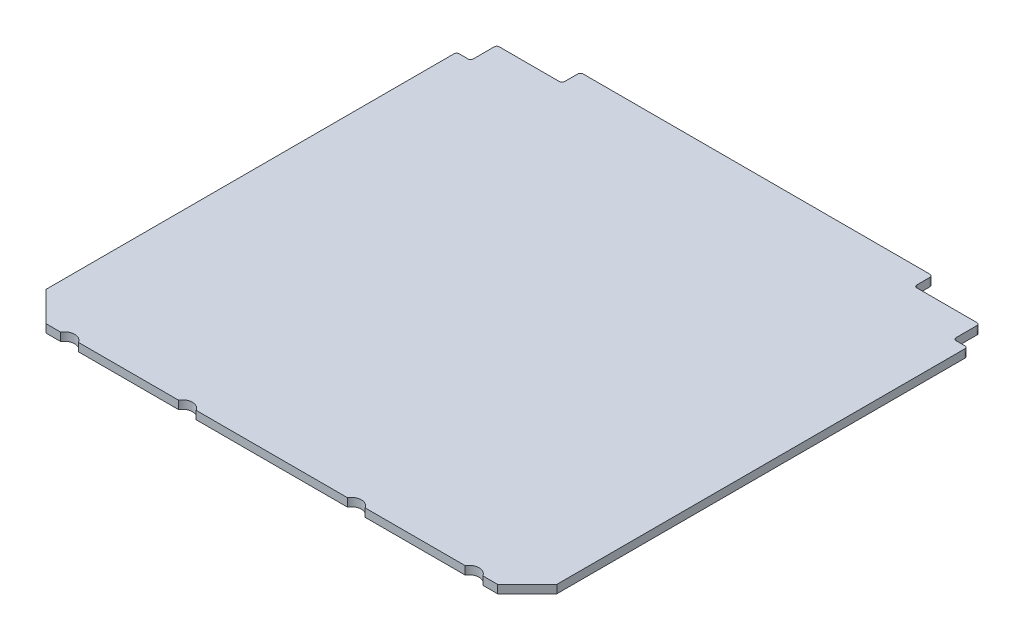
ISO-10303-21;
HEADER;
FILE_DESCRIPTION(('STEP AP214'),'2;1');
FILE_NAME('part.step','',(''),(''),'','','');
FILE_SCHEMA(('AUTOMOTIVE_DESIGN { 1 0 10303 214 1 1 1 1 }'));
ENDSEC;
DATA;
#1=APPLICATION_CONTEXT('core data for automotive mechanical design processes');
#2=APPLICATION_PROTOCOL_DEFINITION('international standard','automotive_design',2000,#1);
#3=PRODUCT_CONTEXT('',#1,'mechanical');
#4=PRODUCT('Part','Part','',(#3));
#5=PRODUCT_RELATED_PRODUCT_CATEGORY('part','',(#4));
#6=PRODUCT_DEFINITION_FORMATION('','',#4);
#7=PRODUCT_DEFINITION_CONTEXT('part definition',#1,'design');
#8=PRODUCT_DEFINITION('design','',#6,#7);
#9=PRODUCT_DEFINITION_SHAPE('','',#8);
#10=(LENGTH_UNIT() NAMED_UNIT(*) SI_UNIT(.MILLI.,.METRE.));
#11=(NAMED_UNIT(*) PLANE_ANGLE_UNIT() SI_UNIT($,.RADIAN.));
#12=(NAMED_UNIT(*) SI_UNIT($,.STERADIAN.) SOLID_ANGLE_UNIT());
#13=UNCERTAINTY_MEASURE_WITH_UNIT(LENGTH_MEASURE(1.E-05),#10,'distance_accuracy_value','');
#14=(GEOMETRIC_REPRESENTATION_CONTEXT(3) GLOBAL_UNCERTAINTY_ASSIGNED_CONTEXT((#13)) GLOBAL_UNIT_ASSIGNED_CONTEXT((#10,
#11,#12)) REPRESENTATION_CONTEXT('',''));
#15=CARTESIAN_POINT('',(0.,0.,0.));
#16=DIRECTION('',(0.,0.,1.));
#17=DIRECTION('',(1.,0.,0.));
#18=AXIS2_PLACEMENT_3D('',#15,#16,#17);
#19=CARTESIAN_POINT('',(-44.4499999999997,0.8,44.4500000000004));
#20=DIRECTION('',(0.707106781186542,0.,-0.707106781186553));
#21=DIRECTION('',(-0.707106781186553,0.,-0.707106781186542));
#22=AXIS2_PLACEMENT_3D('',#19,#20,#21);
#23=PLANE('',#22);
#24=DIRECTION('',(0.,1.,0.));
#25=VECTOR('',#24,1.);
#26=CARTESIAN_POINT('',(-44.1000000000001,-0.8,44.8));
#27=LINE('',#26,#25);
#28=CARTESIAN_POINT('',(-44.1000000000001,-0.8,44.8));
#29=VERTEX_POINT('',#28);
#30=CARTESIAN_POINT('',(-44.1000000000001,0.8,44.8));
#31=VERTEX_POINT('',#30);
#32=EDGE_CURVE('E251',#29,#31,#27,.T.);
#33=ORIENTED_EDGE('',*,*,#32,.T.);
#34=DIRECTION('',(0.707106781186553,0.,0.707106781186542));
#35=VECTOR('',#34,1.);
#36=CARTESIAN_POINT('',(-44.4499999999997,0.8,44.4500000000004));
#37=LINE('',#36,#35);
#38=CARTESIAN_POINT('',(-49.9000000000001,0.8,39.));
#39=VERTEX_POINT('',#38);
#40=EDGE_CURVE('E266',#39,#31,#37,.T.);
#41=ORIENTED_EDGE('',*,*,#40,.F.);
#42=DIRECTION('',(0.,1.,0.));
#43=VECTOR('',#42,1.);
#44=CARTESIAN_POINT('',(-49.9000000000001,-0.8,39.));
#45=LINE('',#44,#43);
#46=CARTESIAN_POINT('',(-49.9000000000001,-0.8,39.));
#47=VERTEX_POINT('',#46);
#48=EDGE_CURVE('E283',#47,#39,#45,.T.);
#49=ORIENTED_EDGE('',*,*,#48,.F.);
#50=DIRECTION('',(0.707106781186553,0.,0.707106781186542));
#51=VECTOR('',#50,1.);
#52=CARTESIAN_POINT('',(-44.4499999999997,-0.8,44.4500000000004));
#53=LINE('',#52,#51);
#54=EDGE_CURVE('E268',#47,#29,#53,.T.);
#55=ORIENTED_EDGE('',*,*,#54,.T.);
#56=EDGE_LOOP('',(#33,#41,#49,#55));
#57=FACE_BOUND('',#56,.T.);
#58=ADVANCED_FACE('F39',(#57),#23,.F.);
#59=CARTESIAN_POINT('',(44.4499999999995,0.8,44.4499999999995));
#60=DIRECTION('',(-0.707106781186548,0.,-0.707106781186548));
#61=DIRECTION('',(-0.707106781186548,0.,0.707106781186548));
#62=AXIS2_PLACEMENT_3D('',#59,#60,#61);
#63=PLANE('',#62);
#64=DIRECTION('',(0.,1.,0.));
#65=VECTOR('',#64,1.);
#66=CARTESIAN_POINT('',(44.0999999999991,-0.8,44.8));
#67=LINE('',#66,#65);
#68=CARTESIAN_POINT('',(44.0999999999991,-0.8,44.8));
#69=VERTEX_POINT('',#68);
#70=CARTESIAN_POINT('',(44.0999999999991,0.8,44.8));
#71=VERTEX_POINT('',#70);
#72=EDGE_CURVE('E269',#69,#71,#67,.T.);
#73=ORIENTED_EDGE('',*,*,#72,.F.);
#74=DIRECTION('',(0.707106781186548,0.,-0.707106781186548));
#75=VECTOR('',#74,1.);
#76=CARTESIAN_POINT('',(44.4499999999995,-0.8,44.4499999999995));
#77=LINE('',#76,#75);
#78=CARTESIAN_POINT('',(49.9000000000001,-0.8,38.999999999999));
#79=VERTEX_POINT('',#78);
#80=EDGE_CURVE('E277',#69,#79,#77,.T.);
#81=ORIENTED_EDGE('',*,*,#80,.T.);
#82=DIRECTION('',(0.,1.,0.));
#83=VECTOR('',#82,1.);
#84=CARTESIAN_POINT('',(49.9000000000001,-0.8,38.999999999999));
#85=LINE('',#84,#83);
#86=CARTESIAN_POINT('',(49.9000000000001,0.8,38.999999999999));
#87=VERTEX_POINT('',#86);
#88=EDGE_CURVE('E286',#79,#87,#85,.T.);
#89=ORIENTED_EDGE('',*,*,#88,.T.);
#90=DIRECTION('',(0.707106781186548,0.,-0.707106781186548));
#91=VECTOR('',#90,1.);
#92=CARTESIAN_POINT('',(44.4499999999995,0.8,44.4499999999995));
#93=LINE('',#92,#91);
#94=EDGE_CURVE('E276',#71,#87,#93,.T.);
#95=ORIENTED_EDGE('',*,*,#94,.F.);
#96=EDGE_LOOP('',(#73,#81,#89,#95));
#97=FACE_BOUND('',#96,.T.);
#98=ADVANCED_FACE('F558',(#97),#63,.F.);
#99=CARTESIAN_POINT('',(0.,0.8,0.));
#100=DIRECTION('',(0.,1.,0.));
#101=DIRECTION('',(0.,0.,1.));
#102=AXIS2_PLACEMENT_3D('',#99,#100,#101);
#103=PLANE('',#102);
#104=DIRECTION('',(0.,0.,-1.));
#105=VECTOR('',#104,1.);
#106=CARTESIAN_POINT('',(34.3999999999997,0.8,0.));
#107=LINE('',#106,#105);
#108=CARTESIAN_POINT('',(34.3999999999997,0.8,-46.8));
#109=VERTEX_POINT('',#108);
#110=CARTESIAN_POINT('',(34.3999999999997,0.8,-49.4));
#111=VERTEX_POINT('',#110);
#112=EDGE_CURVE('E479',#109,#111,#107,.T.);
#113=ORIENTED_EDGE('',*,*,#112,.T.);
#114=CARTESIAN_POINT('',(33.8999999999997,0.8,-49.4));
#115=DIRECTION('',(0.,1.,0.));
#116=DIRECTION('',(0.,0.,1.));
#117=AXIS2_PLACEMENT_3D('',#114,#115,#116);
#118=CIRCLE('',#117,0.5);
#119=CARTESIAN_POINT('',(33.8999999999997,0.8,-49.9));
#120=VERTEX_POINT('',#119);
#121=EDGE_CURVE('E353',#111,#120,#118,.T.);
#122=ORIENTED_EDGE('',*,*,#121,.T.);
#123=DIRECTION('',(-1.,0.,0.));
#124=VECTOR('',#123,1.);
#125=CARTESIAN_POINT('',(0.,0.8,-49.9));
#126=LINE('',#125,#124);
#127=CARTESIAN_POINT('',(-33.9000000000002,0.8,-49.9));
#128=VERTEX_POINT('',#127);
#129=EDGE_CURVE('E476',#120,#128,#126,.T.);
#130=ORIENTED_EDGE('',*,*,#129,.T.);
#131=CARTESIAN_POINT('',(-33.9000000000002,0.8,-49.4));
#132=DIRECTION('',(0.,1.,0.));
#133=DIRECTION('',(0.,0.,1.));
#134=AXIS2_PLACEMENT_3D('',#131,#132,#133);
#135=CIRCLE('',#134,0.5);
#136=CARTESIAN_POINT('',(-34.4000000000002,0.8,-49.4));
#137=VERTEX_POINT('',#136);
#138=EDGE_CURVE('E351',#128,#137,#135,.T.);
#139=ORIENTED_EDGE('',*,*,#138,.T.);
#140=DIRECTION('',(0.,0.,1.));
#141=VECTOR('',#140,1.);
#142=CARTESIAN_POINT('',(-34.4000000000002,0.8,0.));
#143=LINE('',#142,#141);
#144=CARTESIAN_POINT('',(-34.4000000000002,0.8,-46.8));
#145=VERTEX_POINT('',#144);
#146=EDGE_CURVE('E474',#137,#145,#143,.T.);
#147=ORIENTED_EDGE('',*,*,#146,.T.);
#148=CARTESIAN_POINT('',(-34.9000000000002,0.8,-46.8));
#149=DIRECTION('',(0.,1.,0.));
#150=DIRECTION('',(0.,0.,1.));
#151=AXIS2_PLACEMENT_3D('',#148,#149,#150);
#152=CIRCLE('',#151,0.5);
#153=CARTESIAN_POINT('',(-34.9000000000002,0.8,-46.3));
#154=VERTEX_POINT('',#153);
#155=EDGE_CURVE('E325',#145,#154,#152,.F.);
#156=ORIENTED_EDGE('',*,*,#155,.T.);
#157=DIRECTION('',(-1.,0.,0.));
#158=VECTOR('',#157,1.);
#159=CARTESIAN_POINT('',(0.,0.8,-46.3));
#160=LINE('',#159,#158);
#161=CARTESIAN_POINT('',(-46.6500000000002,0.8,-46.3));
#162=VERTEX_POINT('',#161);
#163=EDGE_CURVE('E471',#154,#162,#160,.T.);
#164=ORIENTED_EDGE('',*,*,#163,.T.);
#165=CARTESIAN_POINT('',(-46.6500000000002,0.8,-45.8));
#166=DIRECTION('',(0.,1.,0.));
#167=DIRECTION('',(0.,0.,1.));
#168=AXIS2_PLACEMENT_3D('',#165,#166,#167);
#169=CIRCLE('',#168,0.5);
#170=CARTESIAN_POINT('',(-47.1500000000002,0.8,-45.8));
#171=VERTEX_POINT('',#170);
#172=EDGE_CURVE('E294',#162,#171,#169,.T.);
#173=ORIENTED_EDGE('',*,*,#172,.T.);
#174=DIRECTION('',(0.,0.,1.));
#175=VECTOR('',#174,1.);
#176=CARTESIAN_POINT('',(-47.1500000000002,0.8,0.));
#177=LINE('',#176,#175);
#178=CARTESIAN_POINT('',(-47.1500000000002,0.8,-41.7000000000001));
#179=VERTEX_POINT('',#178);
#180=EDGE_CURVE('E468',#171,#179,#177,.T.);
#181=ORIENTED_EDGE('',*,*,#180,.T.);
#182=CARTESIAN_POINT('',(-47.6500000000002,0.8,-41.7000000000001));
#183=DIRECTION('',(0.,1.,0.));
#184=DIRECTION('',(0.,0.,1.));
#185=AXIS2_PLACEMENT_3D('',#182,#183,#184);
#186=CIRCLE('',#185,0.5);
#187=CARTESIAN_POINT('',(-47.6500000000002,0.8,-41.2000000000001));
#188=VERTEX_POINT('',#187);
#189=EDGE_CURVE('E339',#179,#188,#186,.F.);
#190=ORIENTED_EDGE('',*,*,#189,.T.);
#191=DIRECTION('',(1.,0.,0.));
#192=VECTOR('',#191,1.);
#193=CARTESIAN_POINT('',(-49.9000000000001,0.8,-41.2000000000001));
#194=LINE('',#193,#192);
#195=CARTESIAN_POINT('',(-49.4000000000001,0.8,-41.2000000000001));
#196=VERTEX_POINT('',#195);
#197=EDGE_CURVE('E508',#196,#188,#194,.T.);
#198=ORIENTED_EDGE('',*,*,#197,.F.);
#199=CARTESIAN_POINT('',(-49.4000000000001,0.8,-40.7000000000001));
#200=DIRECTION('',(0.,1.,0.));
#201=DIRECTION('',(0.,0.,1.));
#202=AXIS2_PLACEMENT_3D('',#199,#200,#201);
#203=CIRCLE('',#202,0.5);
#204=CARTESIAN_POINT('',(-49.9000000000001,0.8,-40.7000000000001));
#205=VERTEX_POINT('',#204);
#206=EDGE_CURVE('E349',#196,#205,#203,.T.);
#207=ORIENTED_EDGE('',*,*,#206,.T.);
#208=DIRECTION('',(0.,0.,1.));
#209=VECTOR('',#208,1.);
#210=CARTESIAN_POINT('',(-49.9000000000001,0.8,0.));
#211=LINE('',#210,#209);
#212=EDGE_CURVE('E274',#205,#39,#211,.T.);
#213=ORIENTED_EDGE('',*,*,#212,.T.);
#214=ORIENTED_EDGE('',*,*,#40,.T.);
#215=DIRECTION('',(1.,0.,0.));
#216=VECTOR('',#215,1.);
#217=CARTESIAN_POINT('',(0.,0.8,44.8));
#218=LINE('',#217,#216);
#219=CARTESIAN_POINT('',(-41.2320508075689,0.8,44.8));
#220=VERTEX_POINT('',#219);
#221=EDGE_CURVE('E248',#31,#220,#218,.T.);
#222=ORIENTED_EDGE('',*,*,#221,.T.);
#223=CARTESIAN_POINT('',(-39.5,0.8,45.8));
#224=DIRECTION('',(0.,1.,0.));
#225=DIRECTION('',(0.,0.,1.));
#226=AXIS2_PLACEMENT_3D('',#223,#224,#225);
#227=CIRCLE('',#226,2.);
#228=CARTESIAN_POINT('',(-37.7679491924311,0.8,44.8));
#229=VERTEX_POINT('',#228);
#230=EDGE_CURVE('E428',#229,#220,#227,.T.);
#231=ORIENTED_EDGE('',*,*,#230,.F.);
#232=DIRECTION('',(1.,0.,0.));
#233=VECTOR('',#232,1.);
#234=CARTESIAN_POINT('',(0.,0.8,44.8));
#235=LINE('',#234,#233);
#236=CARTESIAN_POINT('',(-18.2320508075689,0.8,44.8));
#237=VERTEX_POINT('',#236);
#238=EDGE_CURVE('E432',#229,#237,#235,.T.);
#239=ORIENTED_EDGE('',*,*,#238,.T.);
#240=CARTESIAN_POINT('',(-16.5,0.8,45.8));
#241=DIRECTION('',(0.,1.,0.));
#242=DIRECTION('',(0.,0.,1.));
#243=AXIS2_PLACEMENT_3D('',#240,#241,#242);
#244=CIRCLE('',#243,2.);
#245=CARTESIAN_POINT('',(-14.7679491924311,0.8,44.8));
#246=VERTEX_POINT('',#245);
#247=EDGE_CURVE('E526',#246,#237,#244,.T.);
#248=ORIENTED_EDGE('',*,*,#247,.F.);
#249=DIRECTION('',(1.,0.,0.));
#250=VECTOR('',#249,1.);
#251=CARTESIAN_POINT('',(0.,0.8,44.8));
#252=LINE('',#251,#250);
#253=CARTESIAN_POINT('',(14.7679491924311,0.8,44.8));
#254=VERTEX_POINT('',#253);
#255=EDGE_CURVE('E523',#246,#254,#252,.T.);
#256=ORIENTED_EDGE('',*,*,#255,.T.);
#257=CARTESIAN_POINT('',(16.5,0.8,45.8));
#258=DIRECTION('',(0.,1.,0.));
#259=DIRECTION('',(0.,0.,1.));
#260=AXIS2_PLACEMENT_3D('',#257,#258,#259);
#261=CIRCLE('',#260,2.);
#262=CARTESIAN_POINT('',(18.2320508075689,0.8,44.8));
#263=VERTEX_POINT('',#262);
#264=EDGE_CURVE('E520',#263,#254,#261,.T.);
#265=ORIENTED_EDGE('',*,*,#264,.F.);
#266=DIRECTION('',(1.,0.,0.));
#267=VECTOR('',#266,1.);
#268=CARTESIAN_POINT('',(0.,0.8,44.8));
#269=LINE('',#268,#267);
#270=CARTESIAN_POINT('',(37.7679491924311,0.8,44.8));
#271=VERTEX_POINT('',#270);
#272=EDGE_CURVE('E517',#263,#271,#269,.T.);
#273=ORIENTED_EDGE('',*,*,#272,.T.);
#274=CARTESIAN_POINT('',(39.5,0.8,45.8));
#275=DIRECTION('',(0.,1.,0.));
#276=DIRECTION('',(0.,0.,1.));
#277=AXIS2_PLACEMENT_3D('',#274,#275,#276);
#278=CIRCLE('',#277,2.);
#279=CARTESIAN_POINT('',(41.2320508075689,0.8,44.8));
#280=VERTEX_POINT('',#279);
#281=EDGE_CURVE('E514',#280,#271,#278,.T.);
#282=ORIENTED_EDGE('',*,*,#281,.F.);
#283=DIRECTION('',(1.,0.,0.));
#284=VECTOR('',#283,1.);
#285=CARTESIAN_POINT('',(0.,0.8,44.8));
#286=LINE('',#285,#284);
#287=EDGE_CURVE('E259',#280,#71,#286,.T.);
#288=ORIENTED_EDGE('',*,*,#287,.T.);
#289=ORIENTED_EDGE('',*,*,#94,.T.);
#290=DIRECTION('',(0.,0.,-1.));
#291=VECTOR('',#290,1.);
#292=CARTESIAN_POINT('',(49.9000000000001,0.8,0.));
#293=LINE('',#292,#291);
#294=CARTESIAN_POINT('',(49.9000000000001,0.8,-40.7000000000001));
#295=VERTEX_POINT('',#294);
#296=EDGE_CURVE('E380',#87,#295,#293,.T.);
#297=ORIENTED_EDGE('',*,*,#296,.T.);
#298=CARTESIAN_POINT('',(49.4000000000001,0.8,-40.7000000000001));
#299=DIRECTION('',(0.,1.,0.));
#300=DIRECTION('',(0.,0.,1.));
#301=AXIS2_PLACEMENT_3D('',#298,#299,#300);
#302=CIRCLE('',#301,0.5);
#303=CARTESIAN_POINT('',(49.4000000000001,0.8,-41.2000000000001));
#304=VERTEX_POINT('',#303);
#305=EDGE_CURVE('E347',#295,#304,#302,.T.);
#306=ORIENTED_EDGE('',*,*,#305,.T.);
#307=DIRECTION('',(1.,0.,0.));
#308=VECTOR('',#307,1.);
#309=CARTESIAN_POINT('',(49.9000000000001,0.8,-41.2000000000001));
#310=LINE('',#309,#308);
#311=CARTESIAN_POINT('',(47.6499999999999,0.8,-41.2000000000001));
#312=VERTEX_POINT('',#311);
#313=EDGE_CURVE('E504',#312,#304,#310,.T.);
#314=ORIENTED_EDGE('',*,*,#313,.F.);
#315=CARTESIAN_POINT('',(47.6499999999999,0.8,-41.7000000000001));
#316=DIRECTION('',(0.,1.,0.));
#317=DIRECTION('',(0.,0.,1.));
#318=AXIS2_PLACEMENT_3D('',#315,#316,#317);
#319=CIRCLE('',#318,0.5);
#320=CARTESIAN_POINT('',(47.1499999999999,0.8,-41.7000000000001));
#321=VERTEX_POINT('',#320);
#322=EDGE_CURVE('E334',#312,#321,#319,.F.);
#323=ORIENTED_EDGE('',*,*,#322,.T.);
#324=DIRECTION('',(0.,0.,-1.));
#325=VECTOR('',#324,1.);
#326=CARTESIAN_POINT('',(47.1499999999999,0.8,0.));
#327=LINE('',#326,#325);
#328=CARTESIAN_POINT('',(47.1499999999999,0.8,-45.8));
#329=VERTEX_POINT('',#328);
#330=EDGE_CURVE('E391',#321,#329,#327,.T.);
#331=ORIENTED_EDGE('',*,*,#330,.T.);
#332=CARTESIAN_POINT('',(46.6499999999999,0.8,-45.8));
#333=DIRECTION('',(0.,1.,0.));
#334=DIRECTION('',(0.,0.,1.));
#335=AXIS2_PLACEMENT_3D('',#332,#333,#334);
#336=CIRCLE('',#335,0.5);
#337=CARTESIAN_POINT('',(46.6499999999999,0.8,-46.3));
#338=VERTEX_POINT('',#337);
#339=EDGE_CURVE('E292',#329,#338,#336,.T.);
#340=ORIENTED_EDGE('',*,*,#339,.T.);
#341=DIRECTION('',(-1.,0.,0.));
#342=VECTOR('',#341,1.);
#343=CARTESIAN_POINT('',(0.,0.8,-46.3));
#344=LINE('',#343,#342);
#345=CARTESIAN_POINT('',(34.8999999999997,0.8,-46.3));
#346=VERTEX_POINT('',#345);
#347=EDGE_CURVE('E396',#338,#346,#344,.T.);
#348=ORIENTED_EDGE('',*,*,#347,.T.);
#349=CARTESIAN_POINT('',(34.8999999999997,0.8,-46.8));
#350=DIRECTION('',(0.,1.,0.));
#351=DIRECTION('',(0.,0.,1.));
#352=AXIS2_PLACEMENT_3D('',#349,#350,#351);
#353=CIRCLE('',#352,0.5);
#354=EDGE_CURVE('E330',#346,#109,#353,.F.);
#355=ORIENTED_EDGE('',*,*,#354,.T.);
#356=EDGE_LOOP('',(#113,#122,#130,#139,#147,#156,#164,#173,#181,#190,#198,#207,#213,#214,#222,
#231,#239,#248,#256,#265,#273,#282,#288,#289,#297,#306,#314,#323,#331,#340,#348,#355));
#357=FACE_BOUND('',#356,.T.);
#358=ADVANCED_FACE('F273',(#357),#103,.T.);
#359=CARTESIAN_POINT('',(0.,-0.8,0.));
#360=DIRECTION('',(0.,1.,0.));
#361=DIRECTION('',(0.,0.,1.));
#362=AXIS2_PLACEMENT_3D('',#359,#360,#361);
#363=PLANE('',#362);
#364=DIRECTION('',(-1.,0.,0.));
#365=VECTOR('',#364,1.);
#366=CARTESIAN_POINT('',(0.,-0.8,-49.9));
#367=LINE('',#366,#365);
#368=CARTESIAN_POINT('',(33.8999999999997,-0.8,-49.9));
#369=VERTEX_POINT('',#368);
#370=CARTESIAN_POINT('',(-33.9000000000002,-0.8,-49.9));
#371=VERTEX_POINT('',#370);
#372=EDGE_CURVE('E407',#369,#371,#367,.T.);
#373=ORIENTED_EDGE('',*,*,#372,.F.);
#374=CARTESIAN_POINT('',(33.8999999999997,-0.8,-49.4));
#375=DIRECTION('',(0.,1.,0.));
#376=DIRECTION('',(0.,0.,1.));
#377=AXIS2_PLACEMENT_3D('',#374,#375,#376);
#378=CIRCLE('',#377,0.5);
#379=CARTESIAN_POINT('',(34.3999999999997,-0.8,-49.4));
#380=VERTEX_POINT('',#379);
#381=EDGE_CURVE('E365',#369,#380,#378,.F.);
#382=ORIENTED_EDGE('',*,*,#381,.T.);
#383=DIRECTION('',(0.,0.,-1.));
#384=VECTOR('',#383,1.);
#385=CARTESIAN_POINT('',(34.3999999999997,-0.8,0.));
#386=LINE('',#385,#384);
#387=CARTESIAN_POINT('',(34.3999999999997,-0.8,-46.8));
#388=VERTEX_POINT('',#387);
#389=EDGE_CURVE('E410',#388,#380,#386,.T.);
#390=ORIENTED_EDGE('',*,*,#389,.F.);
#391=CARTESIAN_POINT('',(34.8999999999997,-0.8,-46.8));
#392=DIRECTION('',(0.,1.,0.));
#393=DIRECTION('',(0.,0.,1.));
#394=AXIS2_PLACEMENT_3D('',#391,#392,#393);
#395=CIRCLE('',#394,0.5);
#396=CARTESIAN_POINT('',(34.8999999999997,-0.8,-46.3));
#397=VERTEX_POINT('',#396);
#398=EDGE_CURVE('E332',#388,#397,#395,.T.);
#399=ORIENTED_EDGE('',*,*,#398,.T.);
#400=DIRECTION('',(-1.,0.,0.));
#401=VECTOR('',#400,1.);
#402=CARTESIAN_POINT('',(0.,-0.8,-46.3));
#403=LINE('',#402,#401);
#404=CARTESIAN_POINT('',(46.6499999999999,-0.8,-46.3));
#405=VERTEX_POINT('',#404);
#406=EDGE_CURVE('E413',#405,#397,#403,.T.);
#407=ORIENTED_EDGE('',*,*,#406,.F.);
#408=CARTESIAN_POINT('',(46.6499999999999,-0.8,-45.8));
#409=DIRECTION('',(0.,1.,0.));
#410=DIRECTION('',(0.,0.,1.));
#411=AXIS2_PLACEMENT_3D('',#408,#409,#410);
#412=CIRCLE('',#411,0.5);
#413=CARTESIAN_POINT('',(47.1499999999999,-0.8,-45.8));
#414=VERTEX_POINT('',#413);
#415=EDGE_CURVE('E301',#405,#414,#412,.F.);
#416=ORIENTED_EDGE('',*,*,#415,.T.);
#417=DIRECTION('',(0.,0.,-1.));
#418=VECTOR('',#417,1.);
#419=CARTESIAN_POINT('',(47.1499999999999,-0.8,0.));
#420=LINE('',#419,#418);
#421=CARTESIAN_POINT('',(47.1499999999999,-0.8,-41.7000000000001));
#422=VERTEX_POINT('',#421);
#423=EDGE_CURVE('E416',#422,#414,#420,.T.);
#424=ORIENTED_EDGE('',*,*,#423,.F.);
#425=CARTESIAN_POINT('',(47.6499999999999,-0.8,-41.7000000000001));
#426=DIRECTION('',(0.,1.,0.));
#427=DIRECTION('',(0.,0.,1.));
#428=AXIS2_PLACEMENT_3D('',#425,#426,#427);
#429=CIRCLE('',#428,0.5);
#430=CARTESIAN_POINT('',(47.6499999999999,-0.8,-41.2000000000001));
#431=VERTEX_POINT('',#430);
#432=EDGE_CURVE('E336',#422,#431,#429,.T.);
#433=ORIENTED_EDGE('',*,*,#432,.T.);
#434=DIRECTION('',(-1.,0.,0.));
#435=VECTOR('',#434,1.);
#436=CARTESIAN_POINT('',(49.9000000000001,-0.8,-41.2000000000001));
#437=LINE('',#436,#435);
#438=CARTESIAN_POINT('',(49.4000000000001,-0.8,-41.2000000000001));
#439=VERTEX_POINT('',#438);
#440=EDGE_CURVE('E502',#439,#431,#437,.T.);
#441=ORIENTED_EDGE('',*,*,#440,.F.);
#442=CARTESIAN_POINT('',(49.4000000000001,-0.8,-40.7000000000001));
#443=DIRECTION('',(0.,1.,0.));
#444=DIRECTION('',(0.,0.,1.));
#445=AXIS2_PLACEMENT_3D('',#442,#443,#444);
#446=CIRCLE('',#445,0.5);
#447=CARTESIAN_POINT('',(49.9000000000001,-0.8,-40.7000000000001));
#448=VERTEX_POINT('',#447);
#449=EDGE_CURVE('E360',#439,#448,#446,.F.);
#450=ORIENTED_EDGE('',*,*,#449,.T.);
#451=DIRECTION('',(0.,0.,-1.));
#452=VECTOR('',#451,1.);
#453=CARTESIAN_POINT('',(49.9000000000001,-0.8,0.));
#454=LINE('',#453,#452);
#455=EDGE_CURVE('E383',#79,#448,#454,.T.);
#456=ORIENTED_EDGE('',*,*,#455,.F.);
#457=ORIENTED_EDGE('',*,*,#80,.F.);
#458=DIRECTION('',(1.,0.,0.));
#459=VECTOR('',#458,1.);
#460=CARTESIAN_POINT('',(0.,-0.8,44.8));
#461=LINE('',#460,#459);
#462=CARTESIAN_POINT('',(41.2320508075689,-0.8,44.8));
#463=VERTEX_POINT('',#462);
#464=EDGE_CURVE('E427',#463,#69,#461,.T.);
#465=ORIENTED_EDGE('',*,*,#464,.F.);
#466=CARTESIAN_POINT('',(39.5,-0.8,45.8));
#467=DIRECTION('',(0.,1.,0.));
#468=DIRECTION('',(0.,0.,1.));
#469=AXIS2_PLACEMENT_3D('',#466,#467,#468);
#470=CIRCLE('',#469,2.);
#471=CARTESIAN_POINT('',(37.7679491924311,-0.8,44.8));
#472=VERTEX_POINT('',#471);
#473=EDGE_CURVE('E430',#463,#472,#470,.T.);
#474=ORIENTED_EDGE('',*,*,#473,.T.);
#475=DIRECTION('',(1.,0.,0.));
#476=VECTOR('',#475,1.);
#477=CARTESIAN_POINT('',(0.,-0.8,44.8));
#478=LINE('',#477,#476);
#479=CARTESIAN_POINT('',(18.2320508075689,-0.8,44.8));
#480=VERTEX_POINT('',#479);
#481=EDGE_CURVE('E438',#480,#472,#478,.T.);
#482=ORIENTED_EDGE('',*,*,#481,.F.);
#483=CARTESIAN_POINT('',(16.5,-0.8,45.8));
#484=DIRECTION('',(0.,1.,0.));
#485=DIRECTION('',(0.,0.,1.));
#486=AXIS2_PLACEMENT_3D('',#483,#484,#485);
#487=CIRCLE('',#486,2.);
#488=CARTESIAN_POINT('',(14.7679491924311,-0.8,44.8));
#489=VERTEX_POINT('',#488);
#490=EDGE_CURVE('E440',#480,#489,#487,.T.);
#491=ORIENTED_EDGE('',*,*,#490,.T.);
#492=DIRECTION('',(1.,0.,0.));
#493=VECTOR('',#492,1.);
#494=CARTESIAN_POINT('',(0.,-0.8,44.8));
#495=LINE('',#494,#493);
#496=CARTESIAN_POINT('',(-14.7679491924311,-0.8,44.8));
#497=VERTEX_POINT('',#496);
#498=EDGE_CURVE('E443',#497,#489,#495,.T.);
#499=ORIENTED_EDGE('',*,*,#498,.F.);
#500=CARTESIAN_POINT('',(-16.5,-0.8,45.8));
#501=DIRECTION('',(0.,1.,0.));
#502=DIRECTION('',(0.,0.,1.));
#503=AXIS2_PLACEMENT_3D('',#500,#501,#502);
#504=CIRCLE('',#503,2.);
#505=CARTESIAN_POINT('',(-18.2320508075689,-0.8,44.8));
#506=VERTEX_POINT('',#505);
#507=EDGE_CURVE('E445',#497,#506,#504,.T.);
#508=ORIENTED_EDGE('',*,*,#507,.T.);
#509=DIRECTION('',(1.,0.,0.));
#510=VECTOR('',#509,1.);
#511=CARTESIAN_POINT('',(0.,-0.8,44.8));
#512=LINE('',#511,#510);
#513=CARTESIAN_POINT('',(-37.7679491924311,-0.8,44.8));
#514=VERTEX_POINT('',#513);
#515=EDGE_CURVE('E448',#514,#506,#512,.T.);
#516=ORIENTED_EDGE('',*,*,#515,.F.);
#517=CARTESIAN_POINT('',(-39.5,-0.8,45.8));
#518=DIRECTION('',(0.,1.,0.));
#519=DIRECTION('',(0.,0.,1.));
#520=AXIS2_PLACEMENT_3D('',#517,#518,#519);
#521=CIRCLE('',#520,2.);
#522=CARTESIAN_POINT('',(-41.2320508075689,-0.8,44.8));
#523=VERTEX_POINT('',#522);
#524=EDGE_CURVE('E270',#514,#523,#521,.T.);
#525=ORIENTED_EDGE('',*,*,#524,.T.);
#526=DIRECTION('',(1.,0.,0.));
#527=VECTOR('',#526,1.);
#528=CARTESIAN_POINT('',(0.,-0.8,44.8));
#529=LINE('',#528,#527);
#530=EDGE_CURVE('E424',#29,#523,#529,.T.);
#531=ORIENTED_EDGE('',*,*,#530,.F.);
#532=ORIENTED_EDGE('',*,*,#54,.F.);
#533=DIRECTION('',(0.,0.,1.));
#534=VECTOR('',#533,1.);
#535=CARTESIAN_POINT('',(-49.9000000000001,-0.8,0.));
#536=LINE('',#535,#534);
#537=CARTESIAN_POINT('',(-49.9000000000001,-0.8,-40.7000000000001));
#538=VERTEX_POINT('',#537);
#539=EDGE_CURVE('E390',#538,#47,#536,.T.);
#540=ORIENTED_EDGE('',*,*,#539,.F.);
#541=CARTESIAN_POINT('',(-49.4000000000001,-0.8,-40.7000000000001));
#542=DIRECTION('',(0.,1.,0.));
#543=DIRECTION('',(0.,0.,1.));
#544=AXIS2_PLACEMENT_3D('',#541,#542,#543);
#545=CIRCLE('',#544,0.5);
#546=CARTESIAN_POINT('',(-49.4000000000001,-0.8,-41.2000000000001));
#547=VERTEX_POINT('',#546);
#548=EDGE_CURVE('E54',#538,#547,#545,.F.);
#549=ORIENTED_EDGE('',*,*,#548,.T.);
#550=DIRECTION('',(-1.,0.,0.));
#551=VECTOR('',#550,1.);
#552=CARTESIAN_POINT('',(-49.9000000000001,-0.8,-41.2000000000001));
#553=LINE('',#552,#551);
#554=CARTESIAN_POINT('',(-47.6500000000002,-0.8,-41.2000000000001));
#555=VERTEX_POINT('',#554);
#556=EDGE_CURVE('E260',#555,#547,#553,.T.);
#557=ORIENTED_EDGE('',*,*,#556,.F.);
#558=CARTESIAN_POINT('',(-47.6500000000002,-0.8,-41.7000000000001));
#559=DIRECTION('',(0.,1.,0.));
#560=DIRECTION('',(0.,0.,1.));
#561=AXIS2_PLACEMENT_3D('',#558,#559,#560);
#562=CIRCLE('',#561,0.5);
#563=CARTESIAN_POINT('',(-47.1500000000002,-0.8,-41.7000000000001));
#564=VERTEX_POINT('',#563);
#565=EDGE_CURVE('E342',#555,#564,#562,.T.);
#566=ORIENTED_EDGE('',*,*,#565,.T.);
#567=DIRECTION('',(0.,0.,1.));
#568=VECTOR('',#567,1.);
#569=CARTESIAN_POINT('',(-47.1500000000002,-0.8,0.));
#570=LINE('',#569,#568);
#571=CARTESIAN_POINT('',(-47.1500000000002,-0.8,-45.8));
#572=VERTEX_POINT('',#571);
#573=EDGE_CURVE('E393',#572,#564,#570,.T.);
#574=ORIENTED_EDGE('',*,*,#573,.F.);
#575=CARTESIAN_POINT('',(-46.6500000000002,-0.8,-45.8));
#576=DIRECTION('',(0.,1.,0.));
#577=DIRECTION('',(0.,0.,1.));
#578=AXIS2_PLACEMENT_3D('',#575,#576,#577);
#579=CIRCLE('',#578,0.5);
#580=CARTESIAN_POINT('',(-46.6500000000002,-0.8,-46.3));
#581=VERTEX_POINT('',#580);
#582=EDGE_CURVE('E303',#572,#581,#579,.F.);
#583=ORIENTED_EDGE('',*,*,#582,.T.);
#584=DIRECTION('',(-1.,0.,0.));
#585=VECTOR('',#584,1.);
#586=CARTESIAN_POINT('',(0.,-0.8,-46.3));
#587=LINE('',#586,#585);
#588=CARTESIAN_POINT('',(-34.9000000000002,-0.8,-46.3));
#589=VERTEX_POINT('',#588);
#590=EDGE_CURVE('E402',#589,#581,#587,.T.);
#591=ORIENTED_EDGE('',*,*,#590,.F.);
#592=CARTESIAN_POINT('',(-34.9000000000002,-0.8,-46.8));
#593=DIRECTION('',(0.,1.,0.));
#594=DIRECTION('',(0.,0.,1.));
#595=AXIS2_PLACEMENT_3D('',#592,#593,#594);
#596=CIRCLE('',#595,0.5);
#597=CARTESIAN_POINT('',(-34.4000000000002,-0.8,-46.8));
#598=VERTEX_POINT('',#597);
#599=EDGE_CURVE('E327',#589,#598,#596,.T.);
#600=ORIENTED_EDGE('',*,*,#599,.T.);
#601=DIRECTION('',(0.,0.,1.));
#602=VECTOR('',#601,1.);
#603=CARTESIAN_POINT('',(-34.4000000000002,-0.8,0.));
#604=LINE('',#603,#602);
#605=CARTESIAN_POINT('',(-34.4000000000002,-0.8,-49.4));
#606=VERTEX_POINT('',#605);
#607=EDGE_CURVE('E405',#606,#598,#604,.T.);
#608=ORIENTED_EDGE('',*,*,#607,.F.);
#609=CARTESIAN_POINT('',(-33.9000000000002,-0.8,-49.4));
#610=DIRECTION('',(0.,1.,0.));
#611=DIRECTION('',(0.,0.,1.));
#612=AXIS2_PLACEMENT_3D('',#609,#610,#611);
#613=CIRCLE('',#612,0.5);
#614=EDGE_CURVE('E363',#606,#371,#613,.F.);
#615=ORIENTED_EDGE('',*,*,#614,.T.);
#616=EDGE_LOOP('',(#373,#382,#390,#399,#407,#416,#424,#433,#441,#450,#456,#457,#465,#474,#482,
#491,#499,#508,#516,#525,#531,#532,#540,#549,#557,#566,#574,#583,#591,#600,#608,#615));
#617=FACE_BOUND('',#616,.T.);
#618=ADVANCED_FACE('F422',(#617),#363,.F.);
#619=CARTESIAN_POINT('',(49.9000000000001,-0.8,0.));
#620=DIRECTION('',(1.,0.,0.));
#621=DIRECTION('',(0.,0.,-1.));
#622=AXIS2_PLACEMENT_3D('',#619,#620,#621);
#623=PLANE('',#622);
#624=ORIENTED_EDGE('',*,*,#455,.T.);
#625=DIRECTION('',(0.,1.,0.));
#626=VECTOR('',#625,1.);
#627=CARTESIAN_POINT('',(49.9000000000001,0.8,-40.7000000000001));
#628=LINE('',#627,#626);
#629=EDGE_CURVE('E47',#448,#295,#628,.T.);
#630=ORIENTED_EDGE('',*,*,#629,.T.);
#631=ORIENTED_EDGE('',*,*,#296,.F.);
#632=ORIENTED_EDGE('',*,*,#88,.F.);
#633=EDGE_LOOP('',(#624,#630,#631,#632));
#634=FACE_BOUND('',#633,.T.);
#635=ADVANCED_FACE('F378',(#634),#623,.T.);
#636=CARTESIAN_POINT('',(47.1499999999999,-0.8,0.));
#637=DIRECTION('',(1.,0.,0.));
#638=DIRECTION('',(0.,0.,-1.));
#639=AXIS2_PLACEMENT_3D('',#636,#637,#638);
#640=PLANE('',#639);
#641=ORIENTED_EDGE('',*,*,#423,.T.);
#642=DIRECTION('',(0.,1.,0.));
#643=VECTOR('',#642,1.);
#644=CARTESIAN_POINT('',(47.1499999999999,-0.8,-45.8));
#645=LINE('',#644,#643);
#646=EDGE_CURVE('E307',#414,#329,#645,.T.);
#647=ORIENTED_EDGE('',*,*,#646,.T.);
#648=ORIENTED_EDGE('',*,*,#330,.F.);
#649=DIRECTION('',(0.,1.,0.));
#650=VECTOR('',#649,1.);
#651=CARTESIAN_POINT('',(47.1499999999999,-0.8,-41.7000000000001));
#652=LINE('',#651,#650);
#653=EDGE_CURVE('E305',#321,#422,#652,.F.);
#654=ORIENTED_EDGE('',*,*,#653,.T.);
#655=EDGE_LOOP('',(#641,#647,#648,#654));
#656=FACE_BOUND('',#655,.T.);
#657=ADVANCED_FACE('F495',(#656),#640,.T.);
#658=CARTESIAN_POINT('',(0.,-0.8,-46.3));
#659=DIRECTION('',(0.,0.,-1.));
#660=DIRECTION('',(-1.,0.,0.));
#661=AXIS2_PLACEMENT_3D('',#658,#659,#660);
#662=PLANE('',#661);
#663=ORIENTED_EDGE('',*,*,#347,.F.);
#664=DIRECTION('',(0.,1.,0.));
#665=VECTOR('',#664,1.);
#666=CARTESIAN_POINT('',(46.6499999999999,-0.8,-46.3));
#667=LINE('',#666,#665);
#668=EDGE_CURVE('E313',#338,#405,#667,.F.);
#669=ORIENTED_EDGE('',*,*,#668,.T.);
#670=ORIENTED_EDGE('',*,*,#406,.T.);
#671=DIRECTION('',(0.,1.,0.));
#672=VECTOR('',#671,1.);
#673=CARTESIAN_POINT('',(34.8999999999997,0.8,-46.3));
#674=LINE('',#673,#672);
#675=EDGE_CURVE('E310',#397,#346,#674,.T.);
#676=ORIENTED_EDGE('',*,*,#675,.T.);
#677=EDGE_LOOP('',(#663,#669,#670,#676));
#678=FACE_BOUND('',#677,.T.);
#679=ADVANCED_FACE('F485',(#678),#662,.T.);
#680=CARTESIAN_POINT('',(34.3999999999997,-0.8,0.));
#681=DIRECTION('',(1.,0.,0.));
#682=DIRECTION('',(0.,0.,-1.));
#683=AXIS2_PLACEMENT_3D('',#680,#681,#682);
#684=PLANE('',#683);
#685=ORIENTED_EDGE('',*,*,#389,.T.);
#686=DIRECTION('',(0.,1.,0.));
#687=VECTOR('',#686,1.);
#688=CARTESIAN_POINT('',(34.3999999999997,-0.8,-49.4));
#689=LINE('',#688,#687);
#690=EDGE_CURVE('E344',#380,#111,#689,.T.);
#691=ORIENTED_EDGE('',*,*,#690,.T.);
#692=ORIENTED_EDGE('',*,*,#112,.F.);
#693=DIRECTION('',(0.,1.,0.));
#694=VECTOR('',#693,1.);
#695=CARTESIAN_POINT('',(34.3999999999997,-0.8,-46.8));
#696=LINE('',#695,#694);
#697=EDGE_CURVE('E318',#109,#388,#696,.F.);
#698=ORIENTED_EDGE('',*,*,#697,.T.);
#699=EDGE_LOOP('',(#685,#691,#692,#698));
#700=FACE_BOUND('',#699,.T.);
#701=ADVANCED_FACE('F647',(#700),#684,.T.);
#702=CARTESIAN_POINT('',(0.,-0.8,-49.9));
#703=DIRECTION('',(0.,0.,-1.));
#704=DIRECTION('',(-1.,0.,0.));
#705=AXIS2_PLACEMENT_3D('',#702,#703,#704);
#706=PLANE('',#705);
#707=ORIENTED_EDGE('',*,*,#129,.F.);
#708=DIRECTION('',(0.,1.,0.));
#709=VECTOR('',#708,1.);
#710=CARTESIAN_POINT('',(33.8999999999997,-0.8,-49.9));
#711=LINE('',#710,#709);
#712=EDGE_CURVE('E358',#120,#369,#711,.F.);
#713=ORIENTED_EDGE('',*,*,#712,.T.);
#714=ORIENTED_EDGE('',*,*,#372,.T.);
#715=DIRECTION('',(0.,1.,0.));
#716=VECTOR('',#715,1.);
#717=CARTESIAN_POINT('',(-33.9000000000002,-0.8,-49.9));
#718=LINE('',#717,#716);
#719=EDGE_CURVE('E355',#371,#128,#718,.T.);
#720=ORIENTED_EDGE('',*,*,#719,.T.);
#721=EDGE_LOOP('',(#707,#713,#714,#720));
#722=FACE_BOUND('',#721,.T.);
#723=ADVANCED_FACE('F641',(#722),#706,.T.);
#724=CARTESIAN_POINT('',(-34.4000000000002,-0.8,0.));
#725=DIRECTION('',(-1.,0.,0.));
#726=DIRECTION('',(0.,0.,1.));
#727=AXIS2_PLACEMENT_3D('',#724,#725,#726);
#728=PLANE('',#727);
#729=ORIENTED_EDGE('',*,*,#146,.F.);
#730=DIRECTION('',(0.,1.,0.));
#731=VECTOR('',#730,1.);
#732=CARTESIAN_POINT('',(-34.4000000000002,-0.8,-49.4));
#733=LINE('',#732,#731);
#734=EDGE_CURVE('E367',#137,#606,#733,.F.);
#735=ORIENTED_EDGE('',*,*,#734,.T.);
#736=ORIENTED_EDGE('',*,*,#607,.T.);
#737=DIRECTION('',(0.,1.,0.));
#738=VECTOR('',#737,1.);
#739=CARTESIAN_POINT('',(-34.4000000000002,0.8,-46.8));
#740=LINE('',#739,#738);
#741=EDGE_CURVE('E315',#598,#145,#740,.T.);
#742=ORIENTED_EDGE('',*,*,#741,.T.);
#743=EDGE_LOOP('',(#729,#735,#736,#742));
#744=FACE_BOUND('',#743,.T.);
#745=ADVANCED_FACE('F657',(#744),#728,.T.);
#746=CARTESIAN_POINT('',(0.,-0.8,-46.3));
#747=DIRECTION('',(0.,0.,-1.));
#748=DIRECTION('',(-1.,0.,0.));
#749=AXIS2_PLACEMENT_3D('',#746,#747,#748);
#750=PLANE('',#749);
#751=ORIENTED_EDGE('',*,*,#590,.T.);
#752=DIRECTION('',(0.,1.,0.));
#753=VECTOR('',#752,1.);
#754=CARTESIAN_POINT('',(-46.6500000000002,-0.8,-46.3));
#755=LINE('',#754,#753);
#756=EDGE_CURVE('E289',#581,#162,#755,.T.);
#757=ORIENTED_EDGE('',*,*,#756,.T.);
#758=ORIENTED_EDGE('',*,*,#163,.F.);
#759=DIRECTION('',(0.,1.,0.));
#760=VECTOR('',#759,1.);
#761=CARTESIAN_POINT('',(-34.9000000000002,-0.8,-46.3));
#762=LINE('',#761,#760);
#763=EDGE_CURVE('E279',#154,#589,#762,.F.);
#764=ORIENTED_EDGE('',*,*,#763,.T.);
#765=EDGE_LOOP('',(#751,#757,#758,#764));
#766=FACE_BOUND('',#765,.T.);
#767=ADVANCED_FACE('F629',(#766),#750,.T.);
#768=CARTESIAN_POINT('',(-47.1500000000002,-0.8,0.));
#769=DIRECTION('',(-1.,0.,0.));
#770=DIRECTION('',(0.,0.,1.));
#771=AXIS2_PLACEMENT_3D('',#768,#769,#770);
#772=PLANE('',#771);
#773=ORIENTED_EDGE('',*,*,#180,.F.);
#774=DIRECTION('',(0.,1.,0.));
#775=VECTOR('',#774,1.);
#776=CARTESIAN_POINT('',(-47.1500000000002,-0.8,-45.8));
#777=LINE('',#776,#775);
#778=EDGE_CURVE('E299',#171,#572,#777,.F.);
#779=ORIENTED_EDGE('',*,*,#778,.T.);
#780=ORIENTED_EDGE('',*,*,#573,.T.);
#781=DIRECTION('',(0.,1.,0.));
#782=VECTOR('',#781,1.);
#783=CARTESIAN_POINT('',(-47.1500000000002,-0.8,-41.7000000000001));
#784=LINE('',#783,#782);
#785=EDGE_CURVE('E296',#564,#179,#784,.T.);
#786=ORIENTED_EDGE('',*,*,#785,.T.);
#787=EDGE_LOOP('',(#773,#779,#780,#786));
#788=FACE_BOUND('',#787,.T.);
#789=ADVANCED_FACE('F623',(#788),#772,.T.);
#790=CARTESIAN_POINT('',(-49.9000000000001,-0.8,0.));
#791=DIRECTION('',(-1.,0.,0.));
#792=DIRECTION('',(0.,0.,1.));
#793=AXIS2_PLACEMENT_3D('',#790,#791,#792);
#794=PLANE('',#793);
#795=ORIENTED_EDGE('',*,*,#212,.F.);
#796=DIRECTION('',(0.,1.,0.));
#797=VECTOR('',#796,1.);
#798=CARTESIAN_POINT('',(-49.9000000000001,-0.8,-40.7000000000001));
#799=LINE('',#798,#797);
#800=EDGE_CURVE('E62',#205,#538,#799,.F.);
#801=ORIENTED_EDGE('',*,*,#800,.T.);
#802=ORIENTED_EDGE('',*,*,#539,.T.);
#803=ORIENTED_EDGE('',*,*,#48,.T.);
#804=EDGE_LOOP('',(#795,#801,#802,#803));
#805=FACE_BOUND('',#804,.T.);
#806=ADVANCED_FACE('F420',(#805),#794,.T.);
#807=CARTESIAN_POINT('',(0.,-0.8,44.8));
#808=DIRECTION('',(0.,0.,1.));
#809=DIRECTION('',(1.,0.,0.));
#810=AXIS2_PLACEMENT_3D('',#807,#808,#809);
#811=PLANE('',#810);
#812=ORIENTED_EDGE('',*,*,#32,.F.);
#813=ORIENTED_EDGE('',*,*,#530,.T.);
#814=DIRECTION('',(0.,1.,0.));
#815=VECTOR('',#814,1.);
#816=CARTESIAN_POINT('',(-41.2320508075689,-0.8,44.8));
#817=LINE('',#816,#815);
#818=EDGE_CURVE('E254',#523,#220,#817,.T.);
#819=ORIENTED_EDGE('',*,*,#818,.T.);
#820=ORIENTED_EDGE('',*,*,#221,.F.);
#821=EDGE_LOOP('',(#812,#813,#819,#820));
#822=FACE_BOUND('',#821,.T.);
#823=ADVANCED_FACE('F250',(#822),#811,.T.);
#824=CARTESIAN_POINT('',(-39.5,-0.8,45.8));
#825=DIRECTION('',(0.,1.,0.));
#826=DIRECTION('',(0.,0.,1.));
#827=AXIS2_PLACEMENT_3D('',#824,#825,#826);
#828=CYLINDRICAL_SURFACE('',#827,2.);
#829=ORIENTED_EDGE('',*,*,#818,.F.);
#830=ORIENTED_EDGE('',*,*,#524,.F.);
#831=DIRECTION('',(0.,1.,0.));
#832=VECTOR('',#831,1.);
#833=CARTESIAN_POINT('',(-37.7679491924311,-0.8,44.8));
#834=LINE('',#833,#832);
#835=EDGE_CURVE('E452',#514,#229,#834,.T.);
#836=ORIENTED_EDGE('',*,*,#835,.T.);
#837=ORIENTED_EDGE('',*,*,#230,.T.);
#838=EDGE_LOOP('',(#829,#830,#836,#837));
#839=FACE_BOUND('',#838,.T.);
#840=ADVANCED_FACE('F680',(#839),#828,.F.);
#841=CARTESIAN_POINT('',(0.,-0.8,44.8));
#842=DIRECTION('',(0.,0.,1.));
#843=DIRECTION('',(1.,0.,0.));
#844=AXIS2_PLACEMENT_3D('',#841,#842,#843);
#845=PLANE('',#844);
#846=ORIENTED_EDGE('',*,*,#835,.F.);
#847=ORIENTED_EDGE('',*,*,#515,.T.);
#848=DIRECTION('',(0.,1.,0.));
#849=VECTOR('',#848,1.);
#850=CARTESIAN_POINT('',(-18.2320508075689,-0.8,44.8));
#851=LINE('',#850,#849);
#852=EDGE_CURVE('E454',#506,#237,#851,.T.);
#853=ORIENTED_EDGE('',*,*,#852,.T.);
#854=ORIENTED_EDGE('',*,*,#238,.F.);
#855=EDGE_LOOP('',(#846,#847,#853,#854));
#856=FACE_BOUND('',#855,.T.);
#857=ADVANCED_FACE('F532',(#856),#845,.T.);
#858=CARTESIAN_POINT('',(-16.5,-0.8,45.8));
#859=DIRECTION('',(0.,1.,0.));
#860=DIRECTION('',(0.,0.,1.));
#861=AXIS2_PLACEMENT_3D('',#858,#859,#860);
#862=CYLINDRICAL_SURFACE('',#861,2.);
#863=ORIENTED_EDGE('',*,*,#852,.F.);
#864=ORIENTED_EDGE('',*,*,#507,.F.);
#865=DIRECTION('',(0.,1.,0.));
#866=VECTOR('',#865,1.);
#867=CARTESIAN_POINT('',(-14.7679491924311,-0.8,44.8));
#868=LINE('',#867,#866);
#869=EDGE_CURVE('E456',#497,#246,#868,.T.);
#870=ORIENTED_EDGE('',*,*,#869,.T.);
#871=ORIENTED_EDGE('',*,*,#247,.T.);
#872=EDGE_LOOP('',(#863,#864,#870,#871));
#873=FACE_BOUND('',#872,.T.);
#874=ADVANCED_FACE('F536',(#873),#862,.F.);
#875=CARTESIAN_POINT('',(0.,-0.8,44.8));
#876=DIRECTION('',(0.,0.,1.));
#877=DIRECTION('',(1.,0.,0.));
#878=AXIS2_PLACEMENT_3D('',#875,#876,#877);
#879=PLANE('',#878);
#880=ORIENTED_EDGE('',*,*,#869,.F.);
#881=ORIENTED_EDGE('',*,*,#498,.T.);
#882=DIRECTION('',(0.,1.,0.));
#883=VECTOR('',#882,1.);
#884=CARTESIAN_POINT('',(14.7679491924311,-0.8,44.8));
#885=LINE('',#884,#883);
#886=EDGE_CURVE('E458',#489,#254,#885,.T.);
#887=ORIENTED_EDGE('',*,*,#886,.T.);
#888=ORIENTED_EDGE('',*,*,#255,.F.);
#889=EDGE_LOOP('',(#880,#881,#887,#888));
#890=FACE_BOUND('',#889,.T.);
#891=ADVANCED_FACE('F540',(#890),#879,.T.);
#892=CARTESIAN_POINT('',(16.5,-0.8,45.8));
#893=DIRECTION('',(0.,1.,0.));
#894=DIRECTION('',(0.,0.,1.));
#895=AXIS2_PLACEMENT_3D('',#892,#893,#894);
#896=CYLINDRICAL_SURFACE('',#895,2.);
#897=ORIENTED_EDGE('',*,*,#886,.F.);
#898=ORIENTED_EDGE('',*,*,#490,.F.);
#899=DIRECTION('',(0.,1.,0.));
#900=VECTOR('',#899,1.);
#901=CARTESIAN_POINT('',(18.2320508075689,-0.8,44.8));
#902=LINE('',#901,#900);
#903=EDGE_CURVE('E460',#480,#263,#902,.T.);
#904=ORIENTED_EDGE('',*,*,#903,.T.);
#905=ORIENTED_EDGE('',*,*,#264,.T.);
#906=EDGE_LOOP('',(#897,#898,#904,#905));
#907=FACE_BOUND('',#906,.T.);
#908=ADVANCED_FACE('F546',(#907),#896,.F.);
#909=CARTESIAN_POINT('',(0.,-0.8,44.8));
#910=DIRECTION('',(0.,0.,1.));
#911=DIRECTION('',(1.,0.,0.));
#912=AXIS2_PLACEMENT_3D('',#909,#910,#911);
#913=PLANE('',#912);
#914=ORIENTED_EDGE('',*,*,#903,.F.);
#915=ORIENTED_EDGE('',*,*,#481,.T.);
#916=DIRECTION('',(0.,1.,0.));
#917=VECTOR('',#916,1.);
#918=CARTESIAN_POINT('',(37.7679491924311,-0.8,44.8));
#919=LINE('',#918,#917);
#920=EDGE_CURVE('E462',#472,#271,#919,.T.);
#921=ORIENTED_EDGE('',*,*,#920,.T.);
#922=ORIENTED_EDGE('',*,*,#272,.F.);
#923=EDGE_LOOP('',(#914,#915,#921,#922));
#924=FACE_BOUND('',#923,.T.);
#925=ADVANCED_FACE('F550',(#924),#913,.T.);
#926=CARTESIAN_POINT('',(39.5,-0.8,45.8));
#927=DIRECTION('',(0.,1.,0.));
#928=DIRECTION('',(0.,0.,1.));
#929=AXIS2_PLACEMENT_3D('',#926,#927,#928);
#930=CYLINDRICAL_SURFACE('',#929,2.);
#931=ORIENTED_EDGE('',*,*,#920,.F.);
#932=ORIENTED_EDGE('',*,*,#473,.F.);
#933=DIRECTION('',(0.,1.,0.));
#934=VECTOR('',#933,1.);
#935=CARTESIAN_POINT('',(41.2320508075689,-0.8,44.8));
#936=LINE('',#935,#934);
#937=EDGE_CURVE('E464',#463,#280,#936,.T.);
#938=ORIENTED_EDGE('',*,*,#937,.T.);
#939=ORIENTED_EDGE('',*,*,#281,.T.);
#940=EDGE_LOOP('',(#931,#932,#938,#939));
#941=FACE_BOUND('',#940,.T.);
#942=ADVANCED_FACE('F553',(#941),#930,.F.);
#943=CARTESIAN_POINT('',(0.,-0.8,44.8));
#944=DIRECTION('',(0.,0.,1.));
#945=DIRECTION('',(1.,0.,0.));
#946=AXIS2_PLACEMENT_3D('',#943,#944,#945);
#947=PLANE('',#946);
#948=ORIENTED_EDGE('',*,*,#937,.F.);
#949=ORIENTED_EDGE('',*,*,#464,.T.);
#950=ORIENTED_EDGE('',*,*,#72,.T.);
#951=ORIENTED_EDGE('',*,*,#287,.F.);
#952=EDGE_LOOP('',(#948,#949,#950,#951));
#953=FACE_BOUND('',#952,.T.);
#954=ADVANCED_FACE('F561',(#953),#947,.T.);
#955=CARTESIAN_POINT('',(-49.9000000000001,-0.801,-41.2000000000001));
#956=DIRECTION('',(0.,0.,1.));
#957=DIRECTION('',(1.,0.,0.));
#958=AXIS2_PLACEMENT_3D('',#955,#956,#957);
#959=PLANE('',#958);
#960=ORIENTED_EDGE('',*,*,#556,.T.);
#961=DIRECTION('',(0.,1.,0.));
#962=VECTOR('',#961,1.);
#963=CARTESIAN_POINT('',(-49.4000000000001,0.8,-41.2000000000001));
#964=LINE('',#963,#962);
#965=EDGE_CURVE('E369',#547,#196,#964,.T.);
#966=ORIENTED_EDGE('',*,*,#965,.T.);
#967=ORIENTED_EDGE('',*,*,#197,.T.);
#968=DIRECTION('',(0.,1.,0.));
#969=VECTOR('',#968,1.);
#970=CARTESIAN_POINT('',(-47.6500000000002,-0.801,-41.2000000000001));
#971=LINE('',#970,#969);
#972=EDGE_CURVE('E323',#188,#555,#971,.F.);
#973=ORIENTED_EDGE('',*,*,#972,.T.);
#974=EDGE_LOOP('',(#960,#966,#967,#973));
#975=FACE_BOUND('',#974,.T.);
#976=ADVANCED_FACE('F563',(#975),#959,.F.);
#977=CARTESIAN_POINT('',(49.9000000000001,-0.801,-41.2000000000001));
#978=DIRECTION('',(0.,0.,1.));
#979=DIRECTION('',(1.,0.,0.));
#980=AXIS2_PLACEMENT_3D('',#977,#978,#979);
#981=PLANE('',#980);
#982=ORIENTED_EDGE('',*,*,#313,.T.);
#983=DIRECTION('',(0.,1.,0.));
#984=VECTOR('',#983,1.);
#985=CARTESIAN_POINT('',(49.4000000000001,-0.8,-41.2000000000001));
#986=LINE('',#985,#984);
#987=EDGE_CURVE('E11',#304,#439,#986,.F.);
#988=ORIENTED_EDGE('',*,*,#987,.T.);
#989=ORIENTED_EDGE('',*,*,#440,.T.);
#990=DIRECTION('',(0.,1.,0.));
#991=VECTOR('',#990,1.);
#992=CARTESIAN_POINT('',(47.6499999999999,-0.801,-41.2000000000001));
#993=LINE('',#992,#991);
#994=EDGE_CURVE('E320',#431,#312,#993,.T.);
#995=ORIENTED_EDGE('',*,*,#994,.T.);
#996=EDGE_LOOP('',(#982,#988,#989,#995));
#997=FACE_BOUND('',#996,.T.);
#998=ADVANCED_FACE('F507',(#997),#981,.F.);
#999=CARTESIAN_POINT('',(-46.6500000000002,-0.8,-45.8));
#1000=DIRECTION('',(0.,1.,0.));
#1001=DIRECTION('',(0.,0.,1.));
#1002=AXIS2_PLACEMENT_3D('',#999,#1000,#1001);
#1003=CYLINDRICAL_SURFACE('',#1002,0.5);
#1004=ORIENTED_EDGE('',*,*,#582,.F.);
#1005=ORIENTED_EDGE('',*,*,#778,.F.);
#1006=ORIENTED_EDGE('',*,*,#172,.F.);
#1007=ORIENTED_EDGE('',*,*,#756,.F.);
#1008=EDGE_LOOP('',(#1004,#1005,#1006,#1007));
#1009=FACE_BOUND('',#1008,.T.);
#1010=ADVANCED_FACE('F581',(#1009),#1003,.T.);
#1011=CARTESIAN_POINT('',(46.6499999999999,-0.8,-45.8));
#1012=DIRECTION('',(0.,1.,0.));
#1013=DIRECTION('',(0.,0.,1.));
#1014=AXIS2_PLACEMENT_3D('',#1011,#1012,#1013);
#1015=CYLINDRICAL_SURFACE('',#1014,0.5);
#1016=ORIENTED_EDGE('',*,*,#415,.F.);
#1017=ORIENTED_EDGE('',*,*,#668,.F.);
#1018=ORIENTED_EDGE('',*,*,#339,.F.);
#1019=ORIENTED_EDGE('',*,*,#646,.F.);
#1020=EDGE_LOOP('',(#1016,#1017,#1018,#1019));
#1021=FACE_BOUND('',#1020,.T.);
#1022=ADVANCED_FACE('F490',(#1021),#1015,.T.);
#1023=CARTESIAN_POINT('',(-34.9000000000002,-0.8,-46.8));
#1024=DIRECTION('',(0.,-1.,0.));
#1025=DIRECTION('',(0.,0.,-1.));
#1026=AXIS2_PLACEMENT_3D('',#1023,#1024,#1025);
#1027=CYLINDRICAL_SURFACE('',#1026,0.5);
#1028=ORIENTED_EDGE('',*,*,#599,.F.);
#1029=ORIENTED_EDGE('',*,*,#763,.F.);
#1030=ORIENTED_EDGE('',*,*,#155,.F.);
#1031=ORIENTED_EDGE('',*,*,#741,.F.);
#1032=EDGE_LOOP('',(#1028,#1029,#1030,#1031));
#1033=FACE_BOUND('',#1032,.T.);
#1034=ADVANCED_FACE('F587',(#1033),#1027,.F.);
#1035=CARTESIAN_POINT('',(34.8999999999997,-0.8,-46.8));
#1036=DIRECTION('',(0.,-1.,0.));
#1037=DIRECTION('',(0.,0.,-1.));
#1038=AXIS2_PLACEMENT_3D('',#1035,#1036,#1037);
#1039=CYLINDRICAL_SURFACE('',#1038,0.5);
#1040=ORIENTED_EDGE('',*,*,#398,.F.);
#1041=ORIENTED_EDGE('',*,*,#697,.F.);
#1042=ORIENTED_EDGE('',*,*,#354,.F.);
#1043=ORIENTED_EDGE('',*,*,#675,.F.);
#1044=EDGE_LOOP('',(#1040,#1041,#1042,#1043));
#1045=FACE_BOUND('',#1044,.T.);
#1046=ADVANCED_FACE('F590',(#1045),#1039,.F.);
#1047=CARTESIAN_POINT('',(47.6499999999999,-0.801,-41.7000000000001));
#1048=DIRECTION('',(0.,1.,0.));
#1049=DIRECTION('',(0.,0.,1.));
#1050=AXIS2_PLACEMENT_3D('',#1047,#1048,#1049);
#1051=CYLINDRICAL_SURFACE('',#1050,0.5);
#1052=ORIENTED_EDGE('',*,*,#432,.F.);
#1053=ORIENTED_EDGE('',*,*,#653,.F.);
#1054=ORIENTED_EDGE('',*,*,#322,.F.);
#1055=ORIENTED_EDGE('',*,*,#994,.F.);
#1056=EDGE_LOOP('',(#1052,#1053,#1054,#1055));
#1057=FACE_BOUND('',#1056,.T.);
#1058=ADVANCED_FACE('F499',(#1057),#1051,.F.);
#1059=CARTESIAN_POINT('',(-47.6500000000002,-0.8,-41.7000000000001));
#1060=DIRECTION('',(0.,1.,0.));
#1061=DIRECTION('',(0.,0.,1.));
#1062=AXIS2_PLACEMENT_3D('',#1059,#1060,#1061);
#1063=CYLINDRICAL_SURFACE('',#1062,0.5);
#1064=ORIENTED_EDGE('',*,*,#565,.F.);
#1065=ORIENTED_EDGE('',*,*,#972,.F.);
#1066=ORIENTED_EDGE('',*,*,#189,.F.);
#1067=ORIENTED_EDGE('',*,*,#785,.F.);
#1068=EDGE_LOOP('',(#1064,#1065,#1066,#1067));
#1069=FACE_BOUND('',#1068,.T.);
#1070=ADVANCED_FACE('F597',(#1069),#1063,.F.);
#1071=CARTESIAN_POINT('',(33.8999999999997,-0.8,-49.4));
#1072=DIRECTION('',(0.,1.,0.));
#1073=DIRECTION('',(0.,0.,1.));
#1074=AXIS2_PLACEMENT_3D('',#1071,#1072,#1073);
#1075=CYLINDRICAL_SURFACE('',#1074,0.5);
#1076=ORIENTED_EDGE('',*,*,#381,.F.);
#1077=ORIENTED_EDGE('',*,*,#712,.F.);
#1078=ORIENTED_EDGE('',*,*,#121,.F.);
#1079=ORIENTED_EDGE('',*,*,#690,.F.);
#1080=EDGE_LOOP('',(#1076,#1077,#1078,#1079));
#1081=FACE_BOUND('',#1080,.T.);
#1082=ADVANCED_FACE('F600',(#1081),#1075,.T.);
#1083=CARTESIAN_POINT('',(-33.9000000000002,-0.8,-49.4));
#1084=DIRECTION('',(0.,1.,0.));
#1085=DIRECTION('',(0.,0.,1.));
#1086=AXIS2_PLACEMENT_3D('',#1083,#1084,#1085);
#1087=CYLINDRICAL_SURFACE('',#1086,0.5);
#1088=ORIENTED_EDGE('',*,*,#614,.F.);
#1089=ORIENTED_EDGE('',*,*,#734,.F.);
#1090=ORIENTED_EDGE('',*,*,#138,.F.);
#1091=ORIENTED_EDGE('',*,*,#719,.F.);
#1092=EDGE_LOOP('',(#1088,#1089,#1090,#1091));
#1093=FACE_BOUND('',#1092,.T.);
#1094=ADVANCED_FACE('F604',(#1093),#1087,.T.);
#1095=CARTESIAN_POINT('',(-49.4000000000001,-0.801,-40.7000000000001));
#1096=DIRECTION('',(0.,-1.,0.));
#1097=DIRECTION('',(0.,0.,-1.));
#1098=AXIS2_PLACEMENT_3D('',#1095,#1096,#1097);
#1099=CYLINDRICAL_SURFACE('',#1098,0.5);
#1100=ORIENTED_EDGE('',*,*,#548,.F.);
#1101=ORIENTED_EDGE('',*,*,#800,.F.);
#1102=ORIENTED_EDGE('',*,*,#206,.F.);
#1103=ORIENTED_EDGE('',*,*,#965,.F.);
#1104=EDGE_LOOP('',(#1100,#1101,#1102,#1103));
#1105=FACE_BOUND('',#1104,.T.);
#1106=ADVANCED_FACE('F607',(#1105),#1099,.T.);
#1107=CARTESIAN_POINT('',(49.4000000000001,-0.8,-40.7000000000001));
#1108=DIRECTION('',(0.,-1.,0.));
#1109=DIRECTION('',(0.,0.,-1.));
#1110=AXIS2_PLACEMENT_3D('',#1107,#1108,#1109);
#1111=CYLINDRICAL_SURFACE('',#1110,0.5);
#1112=ORIENTED_EDGE('',*,*,#449,.F.);
#1113=ORIENTED_EDGE('',*,*,#987,.F.);
#1114=ORIENTED_EDGE('',*,*,#305,.F.);
#1115=ORIENTED_EDGE('',*,*,#629,.F.);
#1116=EDGE_LOOP('',(#1112,#1113,#1114,#1115));
#1117=FACE_BOUND('',#1116,.T.);
#1118=ADVANCED_FACE('F41',(#1117),#1111,.T.);
#1119=CLOSED_SHELL('',(#58,#98,#358,#618,#635,#657,#679,#701,#723,#745,#767,#789,#806,#823,#840,
#857,#874,#891,#908,#925,#942,#954,#976,#998,#1010,#1022,#1034,#1046,#1058,#1070,#1082,#1094,
#1106,#1118));
#1120=MANIFOLD_SOLID_BREP('B2',#1119);
#1121=ADVANCED_BREP_SHAPE_REPRESENTATION('',(#18,#1120),#14);
#1122=SHAPE_DEFINITION_REPRESENTATION(#9,#1121);
ENDSEC;
END-ISO-10303-21;
